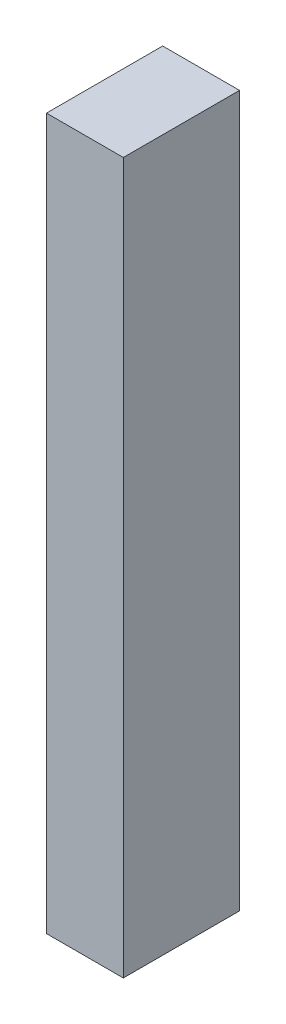
ISO-10303-21;
HEADER;
FILE_DESCRIPTION(('STEP AP214'),'2;1');
FILE_NAME('part.step','',(''),(''),'','','');
FILE_SCHEMA(('AUTOMOTIVE_DESIGN { 1 0 10303 214 1 1 1 1 }'));
ENDSEC;
DATA;
#1=APPLICATION_CONTEXT('core data for automotive mechanical design processes');
#2=APPLICATION_PROTOCOL_DEFINITION('international standard','automotive_design',2000,#1);
#3=PRODUCT_CONTEXT('',#1,'mechanical');
#4=PRODUCT('Part','Part','',(#3));
#5=PRODUCT_RELATED_PRODUCT_CATEGORY('part','',(#4));
#6=PRODUCT_DEFINITION_FORMATION('','',#4);
#7=PRODUCT_DEFINITION_CONTEXT('part definition',#1,'design');
#8=PRODUCT_DEFINITION('design','',#6,#7);
#9=PRODUCT_DEFINITION_SHAPE('','',#8);
#10=(LENGTH_UNIT() NAMED_UNIT(*) SI_UNIT(.MILLI.,.METRE.));
#11=(NAMED_UNIT(*) PLANE_ANGLE_UNIT() SI_UNIT($,.RADIAN.));
#12=(NAMED_UNIT(*) SI_UNIT($,.STERADIAN.) SOLID_ANGLE_UNIT());
#13=UNCERTAINTY_MEASURE_WITH_UNIT(LENGTH_MEASURE(1.E-05),#10,'distance_accuracy_value','');
#14=(GEOMETRIC_REPRESENTATION_CONTEXT(3) GLOBAL_UNCERTAINTY_ASSIGNED_CONTEXT((#13)) GLOBAL_UNIT_ASSIGNED_CONTEXT((#10,
#11,#12)) REPRESENTATION_CONTEXT('',''));
#15=CARTESIAN_POINT('',(0.,0.,0.));
#16=DIRECTION('',(0.,0.,1.));
#17=DIRECTION('',(1.,0.,0.));
#18=AXIS2_PLACEMENT_3D('',#15,#16,#17);
#19=CARTESIAN_POINT('',(10.,-4.13137021804143,1.));
#20=DIRECTION('',(1.,0.,0.));
#21=DIRECTION('',(0.,0.,-1.));
#22=AXIS2_PLACEMENT_3D('',#19,#20,#21);
#23=PLANE('',#22);
#24=DIRECTION('',(0.,-1.,0.));
#25=VECTOR('',#24,1.);
#26=CARTESIAN_POINT('',(10.,-4.13137021804143,0.));
#27=LINE('',#26,#25);
#28=CARTESIAN_POINT('',(10.,1.9830555561651,0.));
#29=VERTEX_POINT('',#28);
#30=CARTESIAN_POINT('',(10.,-4.13137021804143,0.));
#31=VERTEX_POINT('',#30);
#32=EDGE_CURVE('E100',#29,#31,#27,.T.);
#33=ORIENTED_EDGE('',*,*,#32,.T.);
#34=DIRECTION('',(0.,0.,-1.));
#35=VECTOR('',#34,1.);
#36=CARTESIAN_POINT('',(10.,-4.13137021804143,1.));
#37=LINE('',#36,#35);
#38=CARTESIAN_POINT('',(10.,-4.13137021804143,1.));
#39=VERTEX_POINT('',#38);
#40=EDGE_CURVE('E11',#39,#31,#37,.T.);
#41=ORIENTED_EDGE('',*,*,#40,.F.);
#42=DIRECTION('',(0.,-1.,0.));
#43=VECTOR('',#42,1.);
#44=CARTESIAN_POINT('',(10.,-4.13137021804143,1.));
#45=LINE('',#44,#43);
#46=CARTESIAN_POINT('',(10.,1.9830555561651,1.));
#47=VERTEX_POINT('',#46);
#48=EDGE_CURVE('E88',#47,#39,#45,.T.);
#49=ORIENTED_EDGE('',*,*,#48,.F.);
#50=DIRECTION('',(0.,0.,-1.));
#51=VECTOR('',#50,1.);
#52=CARTESIAN_POINT('',(10.,1.9830555561651,1.));
#53=LINE('',#52,#51);
#54=EDGE_CURVE('E96',#47,#29,#53,.T.);
#55=ORIENTED_EDGE('',*,*,#54,.T.);
#56=EDGE_LOOP('',(#33,#41,#49,#55));
#57=FACE_BOUND('',#56,.T.);
#58=ADVANCED_FACE('F37',(#57),#23,.F.);
#59=CARTESIAN_POINT('',(10.,-4.13137021804143,1.));
#60=DIRECTION('',(0.,1.,0.));
#61=DIRECTION('',(0.,0.,1.));
#62=AXIS2_PLACEMENT_3D('',#59,#60,#61);
#63=PLANE('',#62);
#64=DIRECTION('',(1.,0.,0.));
#65=VECTOR('',#64,1.);
#66=CARTESIAN_POINT('',(10.,-4.13137021804143,0.));
#67=LINE('',#66,#65);
#68=CARTESIAN_POINT('',(10.6612827998944,-4.13137021804143,0.));
#69=VERTEX_POINT('',#68);
#70=EDGE_CURVE('E92',#31,#69,#67,.T.);
#71=ORIENTED_EDGE('',*,*,#70,.T.);
#72=DIRECTION('',(0.,0.,-1.));
#73=VECTOR('',#72,1.);
#74=CARTESIAN_POINT('',(10.6612827998944,-4.13137021804143,1.));
#75=LINE('',#74,#73);
#76=CARTESIAN_POINT('',(10.6612827998944,-4.13137021804143,1.));
#77=VERTEX_POINT('',#76);
#78=EDGE_CURVE('E45',#77,#69,#75,.T.);
#79=ORIENTED_EDGE('',*,*,#78,.F.);
#80=DIRECTION('',(1.,0.,0.));
#81=VECTOR('',#80,1.);
#82=CARTESIAN_POINT('',(10.,-4.13137021804143,1.));
#83=LINE('',#82,#81);
#84=EDGE_CURVE('E83',#39,#77,#83,.T.);
#85=ORIENTED_EDGE('',*,*,#84,.F.);
#86=ORIENTED_EDGE('',*,*,#40,.T.);
#87=EDGE_LOOP('',(#71,#79,#85,#86));
#88=FACE_BOUND('',#87,.T.);
#89=ADVANCED_FACE('F91',(#88),#63,.F.);
#90=CARTESIAN_POINT('',(10.6612827998944,-4.13137021804143,1.));
#91=DIRECTION('',(-1.,0.,0.));
#92=DIRECTION('',(0.,0.,1.));
#93=AXIS2_PLACEMENT_3D('',#90,#91,#92);
#94=PLANE('',#93);
#95=DIRECTION('',(0.,1.,0.));
#96=VECTOR('',#95,1.);
#97=CARTESIAN_POINT('',(10.6612827998944,-4.13137021804143,0.));
#98=LINE('',#97,#96);
#99=CARTESIAN_POINT('',(10.6612827998944,1.9830555561651,0.));
#100=VERTEX_POINT('',#99);
#101=EDGE_CURVE('E70',#69,#100,#98,.T.);
#102=ORIENTED_EDGE('',*,*,#101,.T.);
#103=DIRECTION('',(0.,0.,-1.));
#104=VECTOR('',#103,1.);
#105=CARTESIAN_POINT('',(10.6612827998944,1.9830555561651,1.));
#106=LINE('',#105,#104);
#107=CARTESIAN_POINT('',(10.6612827998944,1.9830555561651,1.));
#108=VERTEX_POINT('',#107);
#109=EDGE_CURVE('E93',#108,#100,#106,.T.);
#110=ORIENTED_EDGE('',*,*,#109,.F.);
#111=DIRECTION('',(0.,1.,0.));
#112=VECTOR('',#111,1.);
#113=CARTESIAN_POINT('',(10.6612827998944,-4.13137021804143,1.));
#114=LINE('',#113,#112);
#115=EDGE_CURVE('E86',#77,#108,#114,.T.);
#116=ORIENTED_EDGE('',*,*,#115,.F.);
#117=ORIENTED_EDGE('',*,*,#78,.T.);
#118=EDGE_LOOP('',(#102,#110,#116,#117));
#119=FACE_BOUND('',#118,.T.);
#120=ADVANCED_FACE('F94',(#119),#94,.F.);
#121=CARTESIAN_POINT('',(10.,1.9830555561651,1.));
#122=DIRECTION('',(0.,-1.,0.));
#123=DIRECTION('',(0.,0.,-1.));
#124=AXIS2_PLACEMENT_3D('',#121,#122,#123);
#125=PLANE('',#124);
#126=DIRECTION('',(-1.,0.,0.));
#127=VECTOR('',#126,1.);
#128=CARTESIAN_POINT('',(10.,1.9830555561651,0.));
#129=LINE('',#128,#127);
#130=EDGE_CURVE('E76',#100,#29,#129,.T.);
#131=ORIENTED_EDGE('',*,*,#130,.T.);
#132=ORIENTED_EDGE('',*,*,#54,.F.);
#133=DIRECTION('',(-1.,0.,0.));
#134=VECTOR('',#133,1.);
#135=CARTESIAN_POINT('',(10.,1.9830555561651,1.));
#136=LINE('',#135,#134);
#137=EDGE_CURVE('E53',#108,#47,#136,.T.);
#138=ORIENTED_EDGE('',*,*,#137,.F.);
#139=ORIENTED_EDGE('',*,*,#109,.T.);
#140=EDGE_LOOP('',(#131,#132,#138,#139));
#141=FACE_BOUND('',#140,.T.);
#142=ADVANCED_FACE('F107',(#141),#125,.F.);
#143=CARTESIAN_POINT('',(10.,1.9830555561651,1.));
#144=DIRECTION('',(0.,0.,-1.));
#145=DIRECTION('',(-1.,0.,0.));
#146=AXIS2_PLACEMENT_3D('',#143,#144,#145);
#147=PLANE('',#146);
#148=ORIENTED_EDGE('',*,*,#48,.T.);
#149=ORIENTED_EDGE('',*,*,#84,.T.);
#150=ORIENTED_EDGE('',*,*,#115,.T.);
#151=ORIENTED_EDGE('',*,*,#137,.T.);
#152=EDGE_LOOP('',(#148,#149,#150,#151));
#153=FACE_BOUND('',#152,.T.);
#154=ADVANCED_FACE('F84',(#153),#147,.F.);
#155=CARTESIAN_POINT('',(10.,1.9830555561651,0.));
#156=DIRECTION('',(0.,0.,-1.));
#157=DIRECTION('',(-1.,0.,0.));
#158=AXIS2_PLACEMENT_3D('',#155,#156,#157);
#159=PLANE('',#158);
#160=ORIENTED_EDGE('',*,*,#32,.F.);
#161=ORIENTED_EDGE('',*,*,#130,.F.);
#162=ORIENTED_EDGE('',*,*,#101,.F.);
#163=ORIENTED_EDGE('',*,*,#70,.F.);
#164=EDGE_LOOP('',(#160,#161,#162,#163));
#165=FACE_BOUND('',#164,.T.);
#166=ADVANCED_FACE('F110',(#165),#159,.T.);
#167=CLOSED_SHELL('',(#58,#89,#120,#142,#154,#166));
#168=MANIFOLD_SOLID_BREP('B2',#167);
#169=ADVANCED_BREP_SHAPE_REPRESENTATION('',(#18,#168),#14);
#170=SHAPE_DEFINITION_REPRESENTATION(#9,#169);
ENDSEC;
END-ISO-10303-21;
